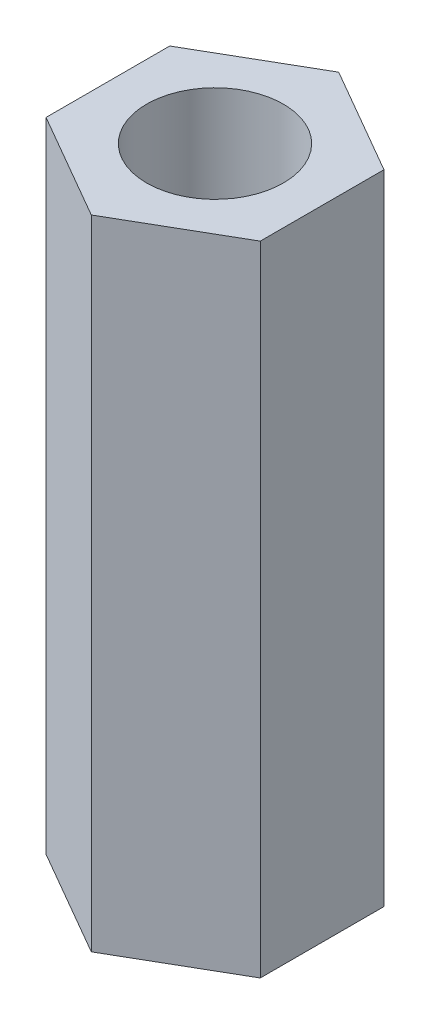
ISO-10303-21;
HEADER;
FILE_DESCRIPTION(('STEP AP214'),'2;1');
FILE_NAME('part.step','',(''),(''),'','','');
FILE_SCHEMA(('AUTOMOTIVE_DESIGN { 1 0 10303 214 1 1 1 1 }'));
ENDSEC;
DATA;
#1=APPLICATION_CONTEXT('core data for automotive mechanical design processes');
#2=APPLICATION_PROTOCOL_DEFINITION('international standard','automotive_design',2000,#1);
#3=PRODUCT_CONTEXT('',#1,'mechanical');
#4=PRODUCT('Part','Part','',(#3));
#5=PRODUCT_RELATED_PRODUCT_CATEGORY('part','',(#4));
#6=PRODUCT_DEFINITION_FORMATION('','',#4);
#7=PRODUCT_DEFINITION_CONTEXT('part definition',#1,'design');
#8=PRODUCT_DEFINITION('design','',#6,#7);
#9=PRODUCT_DEFINITION_SHAPE('','',#8);
#10=(LENGTH_UNIT() NAMED_UNIT(*) SI_UNIT(.MILLI.,.METRE.));
#11=(NAMED_UNIT(*) PLANE_ANGLE_UNIT() SI_UNIT($,.RADIAN.));
#12=(NAMED_UNIT(*) SI_UNIT($,.STERADIAN.) SOLID_ANGLE_UNIT());
#13=UNCERTAINTY_MEASURE_WITH_UNIT(LENGTH_MEASURE(1.E-05),#10,'distance_accuracy_value','');
#14=(GEOMETRIC_REPRESENTATION_CONTEXT(3) GLOBAL_UNCERTAINTY_ASSIGNED_CONTEXT((#13)) GLOBAL_UNIT_ASSIGNED_CONTEXT((#10,
#11,#12)) REPRESENTATION_CONTEXT('',''));
#15=CARTESIAN_POINT('',(0.,0.,0.));
#16=DIRECTION('',(0.,0.,1.));
#17=DIRECTION('',(1.,0.,0.));
#18=AXIS2_PLACEMENT_3D('',#15,#16,#17);
#19=CARTESIAN_POINT('',(0.,14.,0.));
#20=DIRECTION('',(0.,1.,0.));
#21=DIRECTION('',(0.,0.,1.));
#22=AXIS2_PLACEMENT_3D('',#19,#20,#21);
#23=PLANE('',#22);
#24=DIRECTION('',(0.866025403784439,0.,0.5));
#25=VECTOR('',#24,1.);
#26=CARTESIAN_POINT('',(-2.35,14.,1.35677313259562));
#27=LINE('',#26,#25);
#28=CARTESIAN_POINT('',(-2.35,14.,1.35677313259562));
#29=VERTEX_POINT('',#28);
#30=CARTESIAN_POINT('',(0.,14.,2.71354626519124));
#31=VERTEX_POINT('',#30);
#32=EDGE_CURVE('E130',#29,#31,#27,.T.);
#33=ORIENTED_EDGE('',*,*,#32,.T.);
#34=DIRECTION('',(0.866025403784439,0.,-0.5));
#35=VECTOR('',#34,1.);
#36=CARTESIAN_POINT('',(0.,14.,2.71354626519124));
#37=LINE('',#36,#35);
#38=CARTESIAN_POINT('',(2.35,14.,1.35677313259562));
#39=VERTEX_POINT('',#38);
#40=EDGE_CURVE('E88',#31,#39,#37,.T.);
#41=ORIENTED_EDGE('',*,*,#40,.T.);
#42=DIRECTION('',(0.,0.,-1.));
#43=VECTOR('',#42,1.);
#44=CARTESIAN_POINT('',(2.35,14.,1.35677313259562));
#45=LINE('',#44,#43);
#46=CARTESIAN_POINT('',(2.35,14.,-1.35677313259562));
#47=VERTEX_POINT('',#46);
#48=EDGE_CURVE('E101',#39,#47,#45,.T.);
#49=ORIENTED_EDGE('',*,*,#48,.T.);
#50=DIRECTION('',(-0.866025403784439,0.,-0.5));
#51=VECTOR('',#50,1.);
#52=CARTESIAN_POINT('',(2.35,14.,-1.35677313259562));
#53=LINE('',#52,#51);
#54=CARTESIAN_POINT('',(0.,14.,-2.71354626519124));
#55=VERTEX_POINT('',#54);
#56=EDGE_CURVE('E95',#47,#55,#53,.T.);
#57=ORIENTED_EDGE('',*,*,#56,.T.);
#58=DIRECTION('',(-0.866025403784439,0.,0.5));
#59=VECTOR('',#58,1.);
#60=CARTESIAN_POINT('',(0.,14.,-2.71354626519124));
#61=LINE('',#60,#59);
#62=CARTESIAN_POINT('',(-2.35,14.,-1.35677313259562));
#63=VERTEX_POINT('',#62);
#64=EDGE_CURVE('E99',#55,#63,#61,.T.);
#65=ORIENTED_EDGE('',*,*,#64,.T.);
#66=DIRECTION('',(0.,0.,1.));
#67=VECTOR('',#66,1.);
#68=CARTESIAN_POINT('',(-2.35,14.,-1.35677313259562));
#69=LINE('',#68,#67);
#70=EDGE_CURVE('E51',#63,#29,#69,.T.);
#71=ORIENTED_EDGE('',*,*,#70,.T.);
#72=EDGE_LOOP('',(#33,#41,#49,#57,#65,#71));
#73=FACE_BOUND('',#72,.T.);
#74=CARTESIAN_POINT('',(0.,14.,0.));
#75=DIRECTION('',(0.,1.,0.));
#76=DIRECTION('',(0.,0.,1.));
#77=AXIS2_PLACEMENT_3D('',#74,#75,#76);
#78=CIRCLE('',#77,1.5);
#79=CARTESIAN_POINT('',(0.,14.,1.5));
#80=VERTEX_POINT('',#79);
#81=EDGE_CURVE('E123',#80,#80,#78,.T.);
#82=ORIENTED_EDGE('',*,*,#81,.F.);
#83=EDGE_LOOP('',(#82));
#84=FACE_BOUND('',#83,.T.);
#85=ADVANCED_FACE('F34',(#73,#84),#23,.T.);
#86=CARTESIAN_POINT('',(0.,0.,0.));
#87=DIRECTION('',(0.,1.,0.));
#88=DIRECTION('',(0.,0.,1.));
#89=AXIS2_PLACEMENT_3D('',#86,#87,#88);
#90=PLANE('',#89);
#91=DIRECTION('',(0.866025403784439,0.,0.5));
#92=VECTOR('',#91,1.);
#93=CARTESIAN_POINT('',(-2.35,0.,1.35677313259562));
#94=LINE('',#93,#92);
#95=CARTESIAN_POINT('',(-2.35,0.,1.35677313259562));
#96=VERTEX_POINT('',#95);
#97=CARTESIAN_POINT('',(0.,0.,2.71354626519124));
#98=VERTEX_POINT('',#97);
#99=EDGE_CURVE('E119',#96,#98,#94,.T.);
#100=ORIENTED_EDGE('',*,*,#99,.F.);
#101=DIRECTION('',(0.,0.,1.));
#102=VECTOR('',#101,1.);
#103=CARTESIAN_POINT('',(-2.35,0.,-1.35677313259562));
#104=LINE('',#103,#102);
#105=CARTESIAN_POINT('',(-2.35,0.,-1.35677313259562));
#106=VERTEX_POINT('',#105);
#107=EDGE_CURVE('E80',#106,#96,#104,.T.);
#108=ORIENTED_EDGE('',*,*,#107,.F.);
#109=DIRECTION('',(-0.866025403784439,0.,0.5));
#110=VECTOR('',#109,1.);
#111=CARTESIAN_POINT('',(0.,0.,-2.71354626519124));
#112=LINE('',#111,#110);
#113=CARTESIAN_POINT('',(0.,0.,-2.71354626519124));
#114=VERTEX_POINT('',#113);
#115=EDGE_CURVE('E74',#114,#106,#112,.T.);
#116=ORIENTED_EDGE('',*,*,#115,.F.);
#117=DIRECTION('',(-0.866025403784439,0.,-0.5));
#118=VECTOR('',#117,1.);
#119=CARTESIAN_POINT('',(2.35,0.,-1.35677313259562));
#120=LINE('',#119,#118);
#121=CARTESIAN_POINT('',(2.35,0.,-1.35677313259562));
#122=VERTEX_POINT('',#121);
#123=EDGE_CURVE('E109',#122,#114,#120,.T.);
#124=ORIENTED_EDGE('',*,*,#123,.F.);
#125=DIRECTION('',(0.,0.,-1.));
#126=VECTOR('',#125,1.);
#127=CARTESIAN_POINT('',(2.35,0.,1.35677313259562));
#128=LINE('',#127,#126);
#129=CARTESIAN_POINT('',(2.35,0.,1.35677313259562));
#130=VERTEX_POINT('',#129);
#131=EDGE_CURVE('E125',#130,#122,#128,.T.);
#132=ORIENTED_EDGE('',*,*,#131,.F.);
#133=DIRECTION('',(0.866025403784439,0.,-0.5));
#134=VECTOR('',#133,1.);
#135=CARTESIAN_POINT('',(0.,0.,2.71354626519124));
#136=LINE('',#135,#134);
#137=EDGE_CURVE('E122',#98,#130,#136,.T.);
#138=ORIENTED_EDGE('',*,*,#137,.F.);
#139=EDGE_LOOP('',(#100,#108,#116,#124,#132,#138));
#140=FACE_BOUND('',#139,.T.);
#141=CARTESIAN_POINT('',(0.,0.,0.));
#142=DIRECTION('',(0.,1.,0.));
#143=DIRECTION('',(0.,0.,1.));
#144=AXIS2_PLACEMENT_3D('',#141,#142,#143);
#145=CIRCLE('',#144,1.5);
#146=CARTESIAN_POINT('',(0.,0.,1.5));
#147=VERTEX_POINT('',#146);
#148=EDGE_CURVE('E223',#147,#147,#145,.T.);
#149=ORIENTED_EDGE('',*,*,#148,.T.);
#150=EDGE_LOOP('',(#149));
#151=FACE_BOUND('',#150,.T.);
#152=ADVANCED_FACE('F139',(#140,#151),#90,.F.);
#153=CARTESIAN_POINT('',(-2.35,14.,1.35677313259562));
#154=DIRECTION('',(0.5,0.,-0.866025403784439));
#155=DIRECTION('',(-0.866025403784439,0.,-0.5));
#156=AXIS2_PLACEMENT_3D('',#153,#154,#155);
#157=PLANE('',#156);
#158=ORIENTED_EDGE('',*,*,#99,.T.);
#159=DIRECTION('',(0.,-1.,0.));
#160=VECTOR('',#159,1.);
#161=CARTESIAN_POINT('',(0.,14.,2.71354626519124));
#162=LINE('',#161,#160);
#163=EDGE_CURVE('E11',#31,#98,#162,.T.);
#164=ORIENTED_EDGE('',*,*,#163,.F.);
#165=ORIENTED_EDGE('',*,*,#32,.F.);
#166=DIRECTION('',(0.,-1.,0.));
#167=VECTOR('',#166,1.);
#168=CARTESIAN_POINT('',(-2.35,14.,1.35677313259562));
#169=LINE('',#168,#167);
#170=EDGE_CURVE('E115',#29,#96,#169,.T.);
#171=ORIENTED_EDGE('',*,*,#170,.T.);
#172=EDGE_LOOP('',(#158,#164,#165,#171));
#173=FACE_BOUND('',#172,.T.);
#174=ADVANCED_FACE('F36',(#173),#157,.F.);
#175=CARTESIAN_POINT('',(0.,14.,2.71354626519124));
#176=DIRECTION('',(-0.5,0.,-0.866025403784439));
#177=DIRECTION('',(-0.866025403784439,0.,0.5));
#178=AXIS2_PLACEMENT_3D('',#175,#176,#177);
#179=PLANE('',#178);
#180=ORIENTED_EDGE('',*,*,#137,.T.);
#181=DIRECTION('',(0.,-1.,0.));
#182=VECTOR('',#181,1.);
#183=CARTESIAN_POINT('',(2.35,14.,1.35677313259562));
#184=LINE('',#183,#182);
#185=EDGE_CURVE('E43',#39,#130,#184,.T.);
#186=ORIENTED_EDGE('',*,*,#185,.F.);
#187=ORIENTED_EDGE('',*,*,#40,.F.);
#188=ORIENTED_EDGE('',*,*,#163,.T.);
#189=EDGE_LOOP('',(#180,#186,#187,#188));
#190=FACE_BOUND('',#189,.T.);
#191=ADVANCED_FACE('F164',(#190),#179,.F.);
#192=CARTESIAN_POINT('',(2.35,14.,1.35677313259562));
#193=DIRECTION('',(-1.,0.,0.));
#194=DIRECTION('',(0.,0.,1.));
#195=AXIS2_PLACEMENT_3D('',#192,#193,#194);
#196=PLANE('',#195);
#197=ORIENTED_EDGE('',*,*,#131,.T.);
#198=DIRECTION('',(0.,-1.,0.));
#199=VECTOR('',#198,1.);
#200=CARTESIAN_POINT('',(2.35,14.,-1.35677313259562));
#201=LINE('',#200,#199);
#202=EDGE_CURVE('E110',#47,#122,#201,.T.);
#203=ORIENTED_EDGE('',*,*,#202,.F.);
#204=ORIENTED_EDGE('',*,*,#48,.F.);
#205=ORIENTED_EDGE('',*,*,#185,.T.);
#206=EDGE_LOOP('',(#197,#203,#204,#205));
#207=FACE_BOUND('',#206,.T.);
#208=ADVANCED_FACE('F136',(#207),#196,.F.);
#209=CARTESIAN_POINT('',(2.35,14.,-1.35677313259562));
#210=DIRECTION('',(-0.5,0.,0.866025403784439));
#211=DIRECTION('',(0.866025403784439,0.,0.5));
#212=AXIS2_PLACEMENT_3D('',#209,#210,#211);
#213=PLANE('',#212);
#214=ORIENTED_EDGE('',*,*,#123,.T.);
#215=DIRECTION('',(0.,-1.,0.));
#216=VECTOR('',#215,1.);
#217=CARTESIAN_POINT('',(0.,14.,-2.71354626519124));
#218=LINE('',#217,#216);
#219=EDGE_CURVE('E106',#55,#114,#218,.T.);
#220=ORIENTED_EDGE('',*,*,#219,.F.);
#221=ORIENTED_EDGE('',*,*,#56,.F.);
#222=ORIENTED_EDGE('',*,*,#202,.T.);
#223=EDGE_LOOP('',(#214,#220,#221,#222));
#224=FACE_BOUND('',#223,.T.);
#225=ADVANCED_FACE('F107',(#224),#213,.F.);
#226=CARTESIAN_POINT('',(0.,14.,-2.71354626519124));
#227=DIRECTION('',(0.5,0.,0.866025403784439));
#228=DIRECTION('',(0.866025403784439,0.,-0.5));
#229=AXIS2_PLACEMENT_3D('',#226,#227,#228);
#230=PLANE('',#229);
#231=ORIENTED_EDGE('',*,*,#115,.T.);
#232=DIRECTION('',(0.,-1.,0.));
#233=VECTOR('',#232,1.);
#234=CARTESIAN_POINT('',(-2.35,14.,-1.35677313259562));
#235=LINE('',#234,#233);
#236=EDGE_CURVE('E111',#63,#106,#235,.T.);
#237=ORIENTED_EDGE('',*,*,#236,.F.);
#238=ORIENTED_EDGE('',*,*,#64,.F.);
#239=ORIENTED_EDGE('',*,*,#219,.T.);
#240=EDGE_LOOP('',(#231,#237,#238,#239));
#241=FACE_BOUND('',#240,.T.);
#242=ADVANCED_FACE('F113',(#241),#230,.F.);
#243=CARTESIAN_POINT('',(-2.35,14.,-1.35677313259562));
#244=DIRECTION('',(1.,0.,0.));
#245=DIRECTION('',(0.,0.,-1.));
#246=AXIS2_PLACEMENT_3D('',#243,#244,#245);
#247=PLANE('',#246);
#248=ORIENTED_EDGE('',*,*,#107,.T.);
#249=ORIENTED_EDGE('',*,*,#170,.F.);
#250=ORIENTED_EDGE('',*,*,#70,.F.);
#251=ORIENTED_EDGE('',*,*,#236,.T.);
#252=EDGE_LOOP('',(#248,#249,#250,#251));
#253=FACE_BOUND('',#252,.T.);
#254=ADVANCED_FACE('F144',(#253),#247,.F.);
#255=CARTESIAN_POINT('',(0.,14.,0.));
#256=DIRECTION('',(0.,-1.,0.));
#257=DIRECTION('',(0.,0.,-1.));
#258=AXIS2_PLACEMENT_3D('',#255,#256,#257);
#259=CYLINDRICAL_SURFACE('',#258,1.5);
#260=ORIENTED_EDGE('',*,*,#81,.T.);
#261=EDGE_LOOP('',(#260));
#262=FACE_BOUND('',#261,.T.);
#263=ORIENTED_EDGE('',*,*,#148,.F.);
#264=EDGE_LOOP('',(#263));
#265=FACE_BOUND('',#264,.T.);
#266=ADVANCED_FACE('F146',(#262,#265),#259,.F.);
#267=CLOSED_SHELL('',(#85,#152,#174,#191,#208,#225,#242,#254,#266));
#268=MANIFOLD_SOLID_BREP('B2',#267);
#269=ADVANCED_BREP_SHAPE_REPRESENTATION('',(#18,#268),#14);
#270=SHAPE_DEFINITION_REPRESENTATION(#9,#269);
ENDSEC;
END-ISO-10303-21;
